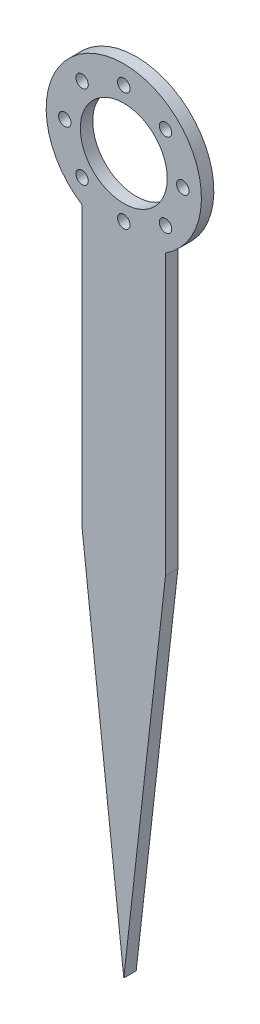
ISO-10303-21;
HEADER;
FILE_DESCRIPTION(('STEP AP214'),'2;1');
FILE_NAME('part.step','',(''),(''),'','','');
FILE_SCHEMA(('AUTOMOTIVE_DESIGN { 1 0 10303 214 1 1 1 1 }'));
ENDSEC;
DATA;
#1=APPLICATION_CONTEXT('core data for automotive mechanical design processes');
#2=APPLICATION_PROTOCOL_DEFINITION('international standard','automotive_design',2000,#1);
#3=PRODUCT_CONTEXT('',#1,'mechanical');
#4=PRODUCT('Part','Part','',(#3));
#5=PRODUCT_RELATED_PRODUCT_CATEGORY('part','',(#4));
#6=PRODUCT_DEFINITION_FORMATION('','',#4);
#7=PRODUCT_DEFINITION_CONTEXT('part definition',#1,'design');
#8=PRODUCT_DEFINITION('design','',#6,#7);
#9=PRODUCT_DEFINITION_SHAPE('','',#8);
#10=(LENGTH_UNIT() NAMED_UNIT(*) SI_UNIT(.MILLI.,.METRE.));
#11=(NAMED_UNIT(*) PLANE_ANGLE_UNIT() SI_UNIT($,.RADIAN.));
#12=(NAMED_UNIT(*) SI_UNIT($,.STERADIAN.) SOLID_ANGLE_UNIT());
#13=UNCERTAINTY_MEASURE_WITH_UNIT(LENGTH_MEASURE(1.E-05),#10,'distance_accuracy_value','');
#14=(GEOMETRIC_REPRESENTATION_CONTEXT(3) GLOBAL_UNCERTAINTY_ASSIGNED_CONTEXT((#13)) GLOBAL_UNIT_ASSIGNED_CONTEXT((#10,
#11,#12)) REPRESENTATION_CONTEXT('',''));
#15=CARTESIAN_POINT('',(0.,0.,0.));
#16=DIRECTION('',(0.,0.,1.));
#17=DIRECTION('',(1.,0.,0.));
#18=AXIS2_PLACEMENT_3D('',#15,#16,#17);
#19=CARTESIAN_POINT('',(0.,0.,4.));
#20=DIRECTION('',(0.,0.,-1.));
#21=DIRECTION('',(-1.,0.,0.));
#22=AXIS2_PLACEMENT_3D('',#19,#20,#21);
#23=PLANE('',#22);
#24=CARTESIAN_POINT('',(0.,0.,4.));
#25=DIRECTION('',(0.,0.,1.));
#26=DIRECTION('',(-1.,0.,0.));
#27=AXIS2_PLACEMENT_3D('',#24,#25,#26);
#28=CIRCLE('',#27,25.);
#29=CARTESIAN_POINT('',(13.4350288425458,-21.0831686423071,4.));
#30=VERTEX_POINT('',#29);
#31=CARTESIAN_POINT('',(-13.435028842543,-21.0831686423089,4.));
#32=VERTEX_POINT('',#31);
#33=EDGE_CURVE('E133',#30,#32,#28,.T.);
#34=ORIENTED_EDGE('',*,*,#33,.T.);
#35=DIRECTION('',(0.,-1.,0.));
#36=VECTOR('',#35,1.);
#37=CARTESIAN_POINT('',(-13.435028842543,-21.0831686423089,4.));
#38=LINE('',#37,#36);
#39=CARTESIAN_POINT('',(-13.435028842543,-111.083168642309,4.));
#40=VERTEX_POINT('',#39);
#41=EDGE_CURVE('E91',#32,#40,#38,.T.);
#42=ORIENTED_EDGE('',*,*,#41,.T.);
#43=DIRECTION('',(0.112264157951396,-0.993678398094406,0.));
#44=VECTOR('',#43,1.);
#45=CARTESIAN_POINT('',(-13.435028842543,-111.083168642309,4.));
#46=LINE('',#45,#44);
#47=CARTESIAN_POINT('',(9.12123018133562E-12,-230.,4.));
#48=VERTEX_POINT('',#47);
#49=EDGE_CURVE('E95',#40,#48,#46,.T.);
#50=ORIENTED_EDGE('',*,*,#49,.T.);
#51=DIRECTION('',(0.112264157951267,0.99367839809442,0.));
#52=VECTOR('',#51,1.);
#53=CARTESIAN_POINT('',(9.12123018133562E-12,-230.,4.));
#54=LINE('',#53,#52);
#55=CARTESIAN_POINT('',(13.4350288425458,-111.083168642307,4.));
#56=VERTEX_POINT('',#55);
#57=EDGE_CURVE('E99',#48,#56,#54,.T.);
#58=ORIENTED_EDGE('',*,*,#57,.T.);
#59=DIRECTION('',(0.,1.,0.));
#60=VECTOR('',#59,1.);
#61=CARTESIAN_POINT('',(13.4350288425458,-111.083168642307,4.));
#62=LINE('',#61,#60);
#63=EDGE_CURVE('E57',#56,#30,#62,.T.);
#64=ORIENTED_EDGE('',*,*,#63,.T.);
#65=EDGE_LOOP('',(#34,#42,#50,#58,#64));
#66=FACE_BOUND('',#65,.T.);
#67=CARTESIAN_POINT('',(0.,0.,4.));
#68=DIRECTION('',(0.,0.,1.));
#69=DIRECTION('',(1.,0.,0.));
#70=AXIS2_PLACEMENT_3D('',#67,#68,#69);
#71=CIRCLE('',#70,14.);
#72=CARTESIAN_POINT('',(14.,0.,4.));
#73=VERTEX_POINT('',#72);
#74=EDGE_CURVE('E124',#73,#73,#71,.T.);
#75=ORIENTED_EDGE('',*,*,#74,.F.);
#76=EDGE_LOOP('',(#75));
#77=FACE_BOUND('',#76,.T.);
#78=CARTESIAN_POINT('',(0.,19.,4.));
#79=DIRECTION('',(0.,0.,1.));
#80=DIRECTION('',(1.,0.,0.));
#81=AXIS2_PLACEMENT_3D('',#78,#79,#80);
#82=CIRCLE('',#81,2.);
#83=CARTESIAN_POINT('',(2.,19.,4.));
#84=VERTEX_POINT('',#83);
#85=EDGE_CURVE('E259',#84,#84,#82,.T.);
#86=ORIENTED_EDGE('',*,*,#85,.F.);
#87=EDGE_LOOP('',(#86));
#88=FACE_BOUND('',#87,.T.);
#89=CARTESIAN_POINT('',(13.4350288425446,13.435028842545,4.));
#90=DIRECTION('',(0.,0.,1.));
#91=DIRECTION('',(1.,0.,0.));
#92=AXIS2_PLACEMENT_3D('',#89,#90,#91);
#93=CIRCLE('',#92,2.00000000000009);
#94=CARTESIAN_POINT('',(15.4350288425447,13.435028842545,4.));
#95=VERTEX_POINT('',#94);
#96=EDGE_CURVE('E251',#95,#95,#93,.T.);
#97=ORIENTED_EDGE('',*,*,#96,.F.);
#98=EDGE_LOOP('',(#97));
#99=FACE_BOUND('',#98,.T.);
#100=CARTESIAN_POINT('',(19.0000000000008,8.06528475388944E-13,4.));
#101=DIRECTION('',(0.,0.,1.));
#102=DIRECTION('',(1.,0.,0.));
#103=AXIS2_PLACEMENT_3D('',#100,#101,#102);
#104=CIRCLE('',#103,2.0000000000006);
#105=CARTESIAN_POINT('',(21.0000000000014,8.06528475388944E-13,4.));
#106=VERTEX_POINT('',#105);
#107=EDGE_CURVE('E243',#106,#106,#104,.T.);
#108=ORIENTED_EDGE('',*,*,#107,.F.);
#109=EDGE_LOOP('',(#108));
#110=FACE_BOUND('',#109,.T.);
#111=CARTESIAN_POINT('',(13.4350288425458,-13.4350288425438,4.));
#112=DIRECTION('',(0.,0.,1.));
#113=DIRECTION('',(1.,0.,0.));
#114=AXIS2_PLACEMENT_3D('',#111,#112,#113);
#115=CIRCLE('',#114,2.00000000000125);
#116=CARTESIAN_POINT('',(15.435028842547,-13.4350288425438,4.));
#117=VERTEX_POINT('',#116);
#118=EDGE_CURVE('E235',#117,#117,#115,.T.);
#119=ORIENTED_EDGE('',*,*,#118,.F.);
#120=EDGE_LOOP('',(#119));
#121=FACE_BOUND('',#120,.T.);
#122=CARTESIAN_POINT('',(1.61305695077789E-12,-19.,4.));
#123=DIRECTION('',(0.,0.,1.));
#124=DIRECTION('',(1.,0.,0.));
#125=AXIS2_PLACEMENT_3D('',#122,#123,#124);
#126=CIRCLE('',#125,2.00000000000167);
#127=CARTESIAN_POINT('',(2.00000000000328,-19.,4.));
#128=VERTEX_POINT('',#127);
#129=EDGE_CURVE('E227',#128,#128,#126,.T.);
#130=ORIENTED_EDGE('',*,*,#129,.F.);
#131=EDGE_LOOP('',(#130));
#132=FACE_BOUND('',#131,.T.);
#133=CARTESIAN_POINT('',(-13.435028842543,-13.435028842545,4.));
#134=DIRECTION('',(0.,0.,1.));
#135=DIRECTION('',(1.,0.,0.));
#136=AXIS2_PLACEMENT_3D('',#133,#134,#135);
#137=CIRCLE('',#136,2.00000000000164);
#138=CARTESIAN_POINT('',(-11.4350288425414,-13.435028842545,4.));
#139=VERTEX_POINT('',#138);
#140=EDGE_CURVE('E219',#139,#139,#137,.T.);
#141=ORIENTED_EDGE('',*,*,#140,.F.);
#142=EDGE_LOOP('',(#141));
#143=FACE_BOUND('',#142,.T.);
#144=CARTESIAN_POINT('',(-18.9999999999992,-8.08855304307324E-13,4.));
#145=DIRECTION('',(0.,0.,1.));
#146=DIRECTION('',(1.,0.,0.));
#147=AXIS2_PLACEMENT_3D('',#144,#145,#146);
#148=CIRCLE('',#147,2.0000000000012);
#149=CARTESIAN_POINT('',(-16.999999999998,-8.08855304307324E-13,4.));
#150=VERTEX_POINT('',#149);
#151=EDGE_CURVE('E211',#150,#150,#148,.T.);
#152=ORIENTED_EDGE('',*,*,#151,.F.);
#153=EDGE_LOOP('',(#152));
#154=FACE_BOUND('',#153,.T.);
#155=CARTESIAN_POINT('',(-13.4350288425442,13.4350288425438,4.));
#156=DIRECTION('',(0.,0.,1.));
#157=DIRECTION('',(1.,0.,0.));
#158=AXIS2_PLACEMENT_3D('',#155,#156,#157);
#159=CIRCLE('',#158,2.00000000000062);
#160=CARTESIAN_POINT('',(-11.4350288425436,13.4350288425438,4.));
#161=VERTEX_POINT('',#160);
#162=EDGE_CURVE('E200',#161,#161,#159,.T.);
#163=ORIENTED_EDGE('',*,*,#162,.F.);
#164=EDGE_LOOP('',(#163));
#165=FACE_BOUND('',#164,.T.);
#166=ADVANCED_FACE('F39',(#66,#77,#88,#99,#110,#121,#132,#143,#154,#165),#23,.F.);
#167=CARTESIAN_POINT('',(0.,0.,0.));
#168=DIRECTION('',(0.,0.,-1.));
#169=DIRECTION('',(-1.,0.,0.));
#170=AXIS2_PLACEMENT_3D('',#167,#168,#169);
#171=PLANE('',#170);
#172=CARTESIAN_POINT('',(-18.9999999999992,-8.08855304307324E-13,0.));
#173=DIRECTION('',(0.,0.,1.));
#174=DIRECTION('',(1.,0.,0.));
#175=AXIS2_PLACEMENT_3D('',#172,#173,#174);
#176=CIRCLE('',#175,2.0000000000012);
#177=CARTESIAN_POINT('',(-16.999999999998,-8.08855304307324E-13,0.));
#178=VERTEX_POINT('',#177);
#179=EDGE_CURVE('E208',#178,#178,#176,.T.);
#180=ORIENTED_EDGE('',*,*,#179,.T.);
#181=EDGE_LOOP('',(#180));
#182=FACE_BOUND('',#181,.T.);
#183=CARTESIAN_POINT('',(1.61305695077789E-12,-19.,0.));
#184=DIRECTION('',(0.,0.,1.));
#185=DIRECTION('',(1.,0.,0.));
#186=AXIS2_PLACEMENT_3D('',#183,#184,#185);
#187=CIRCLE('',#186,2.00000000000167);
#188=CARTESIAN_POINT('',(2.00000000000328,-19.,0.));
#189=VERTEX_POINT('',#188);
#190=EDGE_CURVE('E223',#189,#189,#187,.T.);
#191=ORIENTED_EDGE('',*,*,#190,.T.);
#192=EDGE_LOOP('',(#191));
#193=FACE_BOUND('',#192,.T.);
#194=CARTESIAN_POINT('',(19.0000000000008,8.06528475388944E-13,0.));
#195=DIRECTION('',(0.,0.,1.));
#196=DIRECTION('',(1.,0.,0.));
#197=AXIS2_PLACEMENT_3D('',#194,#195,#196);
#198=CIRCLE('',#197,2.0000000000006);
#199=CARTESIAN_POINT('',(21.0000000000014,8.06528475388944E-13,0.));
#200=VERTEX_POINT('',#199);
#201=EDGE_CURVE('E239',#200,#200,#198,.T.);
#202=ORIENTED_EDGE('',*,*,#201,.T.);
#203=EDGE_LOOP('',(#202));
#204=FACE_BOUND('',#203,.T.);
#205=CARTESIAN_POINT('',(0.,19.,0.));
#206=DIRECTION('',(0.,0.,1.));
#207=DIRECTION('',(1.,0.,0.));
#208=AXIS2_PLACEMENT_3D('',#205,#206,#207);
#209=CIRCLE('',#208,2.);
#210=CARTESIAN_POINT('',(2.,19.,0.));
#211=VERTEX_POINT('',#210);
#212=EDGE_CURVE('E255',#211,#211,#209,.T.);
#213=ORIENTED_EDGE('',*,*,#212,.T.);
#214=EDGE_LOOP('',(#213));
#215=FACE_BOUND('',#214,.T.);
#216=CARTESIAN_POINT('',(0.,0.,0.));
#217=DIRECTION('',(0.,0.,1.));
#218=DIRECTION('',(-1.,0.,0.));
#219=AXIS2_PLACEMENT_3D('',#216,#217,#218);
#220=CIRCLE('',#219,25.);
#221=CARTESIAN_POINT('',(13.4350288425458,-21.0831686423071,0.));
#222=VERTEX_POINT('',#221);
#223=CARTESIAN_POINT('',(-13.435028842543,-21.0831686423089,0.));
#224=VERTEX_POINT('',#223);
#225=EDGE_CURVE('E119',#222,#224,#220,.T.);
#226=ORIENTED_EDGE('',*,*,#225,.F.);
#227=DIRECTION('',(0.,1.,0.));
#228=VECTOR('',#227,1.);
#229=CARTESIAN_POINT('',(13.4350288425458,-111.083168642307,0.));
#230=LINE('',#229,#228);
#231=CARTESIAN_POINT('',(13.4350288425458,-111.083168642307,0.));
#232=VERTEX_POINT('',#231);
#233=EDGE_CURVE('E83',#232,#222,#230,.T.);
#234=ORIENTED_EDGE('',*,*,#233,.F.);
#235=DIRECTION('',(0.112264157951267,0.99367839809442,0.));
#236=VECTOR('',#235,1.);
#237=CARTESIAN_POINT('',(9.12123018133562E-12,-230.,0.));
#238=LINE('',#237,#236);
#239=CARTESIAN_POINT('',(9.12123018133562E-12,-230.,0.));
#240=VERTEX_POINT('',#239);
#241=EDGE_CURVE('E77',#240,#232,#238,.T.);
#242=ORIENTED_EDGE('',*,*,#241,.F.);
#243=DIRECTION('',(0.112264157951396,-0.993678398094406,0.));
#244=VECTOR('',#243,1.);
#245=CARTESIAN_POINT('',(-13.435028842543,-111.083168642309,0.));
#246=LINE('',#245,#244);
#247=CARTESIAN_POINT('',(-13.435028842543,-111.083168642309,0.));
#248=VERTEX_POINT('',#247);
#249=EDGE_CURVE('E107',#248,#240,#246,.T.);
#250=ORIENTED_EDGE('',*,*,#249,.F.);
#251=DIRECTION('',(0.,-1.,0.));
#252=VECTOR('',#251,1.);
#253=CARTESIAN_POINT('',(-13.435028842543,-21.0831686423089,0.));
#254=LINE('',#253,#252);
#255=EDGE_CURVE('E123',#224,#248,#254,.T.);
#256=ORIENTED_EDGE('',*,*,#255,.F.);
#257=EDGE_LOOP('',(#226,#234,#242,#250,#256));
#258=FACE_BOUND('',#257,.T.);
#259=CARTESIAN_POINT('',(0.,0.,0.));
#260=DIRECTION('',(0.,0.,1.));
#261=DIRECTION('',(1.,0.,0.));
#262=AXIS2_PLACEMENT_3D('',#259,#260,#261);
#263=CIRCLE('',#262,14.);
#264=CARTESIAN_POINT('',(14.,0.,0.));
#265=VERTEX_POINT('',#264);
#266=EDGE_CURVE('E263',#265,#265,#263,.T.);
#267=ORIENTED_EDGE('',*,*,#266,.T.);
#268=EDGE_LOOP('',(#267));
#269=FACE_BOUND('',#268,.T.);
#270=CARTESIAN_POINT('',(13.4350288425446,13.435028842545,0.));
#271=DIRECTION('',(0.,0.,1.));
#272=DIRECTION('',(1.,0.,0.));
#273=AXIS2_PLACEMENT_3D('',#270,#271,#272);
#274=CIRCLE('',#273,2.00000000000009);
#275=CARTESIAN_POINT('',(15.4350288425447,13.435028842545,0.));
#276=VERTEX_POINT('',#275);
#277=EDGE_CURVE('E247',#276,#276,#274,.T.);
#278=ORIENTED_EDGE('',*,*,#277,.T.);
#279=EDGE_LOOP('',(#278));
#280=FACE_BOUND('',#279,.T.);
#281=CARTESIAN_POINT('',(13.4350288425458,-13.4350288425438,0.));
#282=DIRECTION('',(0.,0.,1.));
#283=DIRECTION('',(1.,0.,0.));
#284=AXIS2_PLACEMENT_3D('',#281,#282,#283);
#285=CIRCLE('',#284,2.00000000000125);
#286=CARTESIAN_POINT('',(15.435028842547,-13.4350288425438,0.));
#287=VERTEX_POINT('',#286);
#288=EDGE_CURVE('E231',#287,#287,#285,.T.);
#289=ORIENTED_EDGE('',*,*,#288,.T.);
#290=EDGE_LOOP('',(#289));
#291=FACE_BOUND('',#290,.T.);
#292=CARTESIAN_POINT('',(-13.435028842543,-13.435028842545,0.));
#293=DIRECTION('',(0.,0.,1.));
#294=DIRECTION('',(1.,0.,0.));
#295=AXIS2_PLACEMENT_3D('',#292,#293,#294);
#296=CIRCLE('',#295,2.00000000000164);
#297=CARTESIAN_POINT('',(-11.4350288425414,-13.435028842545,0.));
#298=VERTEX_POINT('',#297);
#299=EDGE_CURVE('E215',#298,#298,#296,.T.);
#300=ORIENTED_EDGE('',*,*,#299,.T.);
#301=EDGE_LOOP('',(#300));
#302=FACE_BOUND('',#301,.T.);
#303=CARTESIAN_POINT('',(-13.4350288425442,13.4350288425438,0.));
#304=DIRECTION('',(0.,0.,1.));
#305=DIRECTION('',(1.,0.,0.));
#306=AXIS2_PLACEMENT_3D('',#303,#304,#305);
#307=CIRCLE('',#306,2.00000000000062);
#308=CARTESIAN_POINT('',(-11.4350288425436,13.4350288425438,0.));
#309=VERTEX_POINT('',#308);
#310=EDGE_CURVE('E203',#309,#309,#307,.T.);
#311=ORIENTED_EDGE('',*,*,#310,.T.);
#312=EDGE_LOOP('',(#311));
#313=FACE_BOUND('',#312,.T.);
#314=ADVANCED_FACE('F140',(#182,#193,#204,#215,#258,#269,#280,#291,#302,#313),#171,.T.);
#315=CARTESIAN_POINT('',(0.,0.,4.));
#316=DIRECTION('',(0.,0.,-1.));
#317=DIRECTION('',(-1.,0.,0.));
#318=AXIS2_PLACEMENT_3D('',#315,#316,#317);
#319=CYLINDRICAL_SURFACE('',#318,25.);
#320=ORIENTED_EDGE('',*,*,#225,.T.);
#321=DIRECTION('',(0.,0.,-1.));
#322=VECTOR('',#321,1.);
#323=CARTESIAN_POINT('',(-13.435028842543,-21.0831686423089,4.));
#324=LINE('',#323,#322);
#325=EDGE_CURVE('E11',#32,#224,#324,.T.);
#326=ORIENTED_EDGE('',*,*,#325,.F.);
#327=ORIENTED_EDGE('',*,*,#33,.F.);
#328=DIRECTION('',(0.,0.,-1.));
#329=VECTOR('',#328,1.);
#330=CARTESIAN_POINT('',(13.4350288425458,-21.0831686423071,4.));
#331=LINE('',#330,#329);
#332=EDGE_CURVE('E115',#30,#222,#331,.T.);
#333=ORIENTED_EDGE('',*,*,#332,.T.);
#334=EDGE_LOOP('',(#320,#326,#327,#333));
#335=FACE_BOUND('',#334,.T.);
#336=ADVANCED_FACE('F41',(#335),#319,.T.);
#337=CARTESIAN_POINT('',(-13.435028842543,-21.0831686423089,4.));
#338=DIRECTION('',(1.,0.,0.));
#339=DIRECTION('',(0.,1.,0.));
#340=AXIS2_PLACEMENT_3D('',#337,#338,#339);
#341=PLANE('',#340);
#342=ORIENTED_EDGE('',*,*,#255,.T.);
#343=DIRECTION('',(0.,0.,-1.));
#344=VECTOR('',#343,1.);
#345=CARTESIAN_POINT('',(-13.435028842543,-111.083168642309,4.));
#346=LINE('',#345,#344);
#347=EDGE_CURVE('E49',#40,#248,#346,.T.);
#348=ORIENTED_EDGE('',*,*,#347,.F.);
#349=ORIENTED_EDGE('',*,*,#41,.F.);
#350=ORIENTED_EDGE('',*,*,#325,.T.);
#351=EDGE_LOOP('',(#342,#348,#349,#350));
#352=FACE_BOUND('',#351,.T.);
#353=ADVANCED_FACE('F364',(#352),#341,.F.);
#354=CARTESIAN_POINT('',(-13.435028842543,-111.083168642309,4.));
#355=DIRECTION('',(0.993678398094406,0.112264157951396,0.));
#356=DIRECTION('',(-0.112264157951396,0.993678398094406,0.));
#357=AXIS2_PLACEMENT_3D('',#354,#355,#356);
#358=PLANE('',#357);
#359=ORIENTED_EDGE('',*,*,#249,.T.);
#360=DIRECTION('',(0.,0.,-1.));
#361=VECTOR('',#360,1.);
#362=CARTESIAN_POINT('',(9.12123018133562E-12,-230.,4.));
#363=LINE('',#362,#361);
#364=EDGE_CURVE('E104',#48,#240,#363,.T.);
#365=ORIENTED_EDGE('',*,*,#364,.F.);
#366=ORIENTED_EDGE('',*,*,#49,.F.);
#367=ORIENTED_EDGE('',*,*,#347,.T.);
#368=EDGE_LOOP('',(#359,#365,#366,#367));
#369=FACE_BOUND('',#368,.T.);
#370=ADVANCED_FACE('F105',(#369),#358,.F.);
#371=CARTESIAN_POINT('',(9.12123018133562E-12,-230.,4.));
#372=DIRECTION('',(-0.99367839809442,0.112264157951267,0.));
#373=DIRECTION('',(-0.112264157951267,-0.99367839809442,0.));
#374=AXIS2_PLACEMENT_3D('',#371,#372,#373);
#375=PLANE('',#374);
#376=ORIENTED_EDGE('',*,*,#241,.T.);
#377=DIRECTION('',(0.,0.,-1.));
#378=VECTOR('',#377,1.);
#379=CARTESIAN_POINT('',(13.4350288425458,-111.083168642307,4.));
#380=LINE('',#379,#378);
#381=EDGE_CURVE('E109',#56,#232,#380,.T.);
#382=ORIENTED_EDGE('',*,*,#381,.F.);
#383=ORIENTED_EDGE('',*,*,#57,.F.);
#384=ORIENTED_EDGE('',*,*,#364,.T.);
#385=EDGE_LOOP('',(#376,#382,#383,#384));
#386=FACE_BOUND('',#385,.T.);
#387=ADVANCED_FACE('F111',(#386),#375,.F.);
#388=CARTESIAN_POINT('',(13.4350288425458,-111.083168642307,4.));
#389=DIRECTION('',(-1.,0.,0.));
#390=DIRECTION('',(0.,0.,1.));
#391=AXIS2_PLACEMENT_3D('',#388,#389,#390);
#392=PLANE('',#391);
#393=ORIENTED_EDGE('',*,*,#233,.T.);
#394=ORIENTED_EDGE('',*,*,#332,.F.);
#395=ORIENTED_EDGE('',*,*,#63,.F.);
#396=ORIENTED_EDGE('',*,*,#381,.T.);
#397=EDGE_LOOP('',(#393,#394,#395,#396));
#398=FACE_BOUND('',#397,.T.);
#399=ADVANCED_FACE('F145',(#398),#392,.F.);
#400=CARTESIAN_POINT('',(0.,0.,4.));
#401=DIRECTION('',(0.,0.,-1.));
#402=DIRECTION('',(-1.,0.,0.));
#403=AXIS2_PLACEMENT_3D('',#400,#401,#402);
#404=CYLINDRICAL_SURFACE('',#403,14.);
#405=ORIENTED_EDGE('',*,*,#74,.T.);
#406=EDGE_LOOP('',(#405));
#407=FACE_BOUND('',#406,.T.);
#408=ORIENTED_EDGE('',*,*,#266,.F.);
#409=EDGE_LOOP('',(#408));
#410=FACE_BOUND('',#409,.T.);
#411=ADVANCED_FACE('F147',(#407,#410),#404,.F.);
#412=CARTESIAN_POINT('',(0.,19.,4.));
#413=DIRECTION('',(0.,0.,-1.));
#414=DIRECTION('',(-1.,0.,0.));
#415=AXIS2_PLACEMENT_3D('',#412,#413,#414);
#416=CYLINDRICAL_SURFACE('',#415,2.);
#417=ORIENTED_EDGE('',*,*,#85,.T.);
#418=EDGE_LOOP('',(#417));
#419=FACE_BOUND('',#418,.T.);
#420=ORIENTED_EDGE('',*,*,#212,.F.);
#421=EDGE_LOOP('',(#420));
#422=FACE_BOUND('',#421,.T.);
#423=ADVANCED_FACE('F153',(#419,#422),#416,.F.);
#424=CARTESIAN_POINT('',(13.4350288425446,13.435028842545,4.));
#425=DIRECTION('',(0.,0.,-1.));
#426=DIRECTION('',(-1.,0.,0.));
#427=AXIS2_PLACEMENT_3D('',#424,#425,#426);
#428=CYLINDRICAL_SURFACE('',#427,2.00000000000009);
#429=ORIENTED_EDGE('',*,*,#96,.T.);
#430=EDGE_LOOP('',(#429));
#431=FACE_BOUND('',#430,.T.);
#432=ORIENTED_EDGE('',*,*,#277,.F.);
#433=EDGE_LOOP('',(#432));
#434=FACE_BOUND('',#433,.T.);
#435=ADVANCED_FACE('F167',(#431,#434),#428,.F.);
#436=CARTESIAN_POINT('',(19.0000000000008,8.06528475388944E-13,4.));
#437=DIRECTION('',(0.,0.,-1.));
#438=DIRECTION('',(-1.,0.,0.));
#439=AXIS2_PLACEMENT_3D('',#436,#437,#438);
#440=CYLINDRICAL_SURFACE('',#439,2.0000000000006);
#441=ORIENTED_EDGE('',*,*,#107,.T.);
#442=EDGE_LOOP('',(#441));
#443=FACE_BOUND('',#442,.T.);
#444=ORIENTED_EDGE('',*,*,#201,.F.);
#445=EDGE_LOOP('',(#444));
#446=FACE_BOUND('',#445,.T.);
#447=ADVANCED_FACE('F171',(#443,#446),#440,.F.);
#448=CARTESIAN_POINT('',(13.4350288425458,-13.4350288425438,4.));
#449=DIRECTION('',(0.,0.,-1.));
#450=DIRECTION('',(-1.,0.,0.));
#451=AXIS2_PLACEMENT_3D('',#448,#449,#450);
#452=CYLINDRICAL_SURFACE('',#451,2.00000000000125);
#453=ORIENTED_EDGE('',*,*,#118,.T.);
#454=EDGE_LOOP('',(#453));
#455=FACE_BOUND('',#454,.T.);
#456=ORIENTED_EDGE('',*,*,#288,.F.);
#457=EDGE_LOOP('',(#456));
#458=FACE_BOUND('',#457,.T.);
#459=ADVANCED_FACE('F175',(#455,#458),#452,.F.);
#460=CARTESIAN_POINT('',(1.61305695077789E-12,-19.,4.));
#461=DIRECTION('',(0.,0.,-1.));
#462=DIRECTION('',(-1.,0.,0.));
#463=AXIS2_PLACEMENT_3D('',#460,#461,#462);
#464=CYLINDRICAL_SURFACE('',#463,2.00000000000167);
#465=ORIENTED_EDGE('',*,*,#129,.T.);
#466=EDGE_LOOP('',(#465));
#467=FACE_BOUND('',#466,.T.);
#468=ORIENTED_EDGE('',*,*,#190,.F.);
#469=EDGE_LOOP('',(#468));
#470=FACE_BOUND('',#469,.T.);
#471=ADVANCED_FACE('F179',(#467,#470),#464,.F.);
#472=CARTESIAN_POINT('',(-13.435028842543,-13.435028842545,4.));
#473=DIRECTION('',(0.,0.,-1.));
#474=DIRECTION('',(-1.,0.,0.));
#475=AXIS2_PLACEMENT_3D('',#472,#473,#474);
#476=CYLINDRICAL_SURFACE('',#475,2.00000000000164);
#477=ORIENTED_EDGE('',*,*,#140,.T.);
#478=EDGE_LOOP('',(#477));
#479=FACE_BOUND('',#478,.T.);
#480=ORIENTED_EDGE('',*,*,#299,.F.);
#481=EDGE_LOOP('',(#480));
#482=FACE_BOUND('',#481,.T.);
#483=ADVANCED_FACE('F183',(#479,#482),#476,.F.);
#484=CARTESIAN_POINT('',(-18.9999999999992,-8.08855304307324E-13,4.));
#485=DIRECTION('',(0.,0.,-1.));
#486=DIRECTION('',(-1.,0.,0.));
#487=AXIS2_PLACEMENT_3D('',#484,#485,#486);
#488=CYLINDRICAL_SURFACE('',#487,2.0000000000012);
#489=ORIENTED_EDGE('',*,*,#151,.T.);
#490=EDGE_LOOP('',(#489));
#491=FACE_BOUND('',#490,.T.);
#492=ORIENTED_EDGE('',*,*,#179,.F.);
#493=EDGE_LOOP('',(#492));
#494=FACE_BOUND('',#493,.T.);
#495=ADVANCED_FACE('F187',(#491,#494),#488,.F.);
#496=CARTESIAN_POINT('',(-13.4350288425442,13.4350288425438,4.));
#497=DIRECTION('',(0.,0.,-1.));
#498=DIRECTION('',(-1.,0.,0.));
#499=AXIS2_PLACEMENT_3D('',#496,#497,#498);
#500=CYLINDRICAL_SURFACE('',#499,2.00000000000062);
#501=ORIENTED_EDGE('',*,*,#162,.T.);
#502=EDGE_LOOP('',(#501));
#503=FACE_BOUND('',#502,.T.);
#504=ORIENTED_EDGE('',*,*,#310,.F.);
#505=EDGE_LOOP('',(#504));
#506=FACE_BOUND('',#505,.T.);
#507=ADVANCED_FACE('F191',(#503,#506),#500,.F.);
#508=CLOSED_SHELL('',(#166,#314,#336,#353,#370,#387,#399,#411,#423,#435,#447,#459,#471,#483,
#495,#507));
#509=MANIFOLD_SOLID_BREP('B2',#508);
#510=ADVANCED_BREP_SHAPE_REPRESENTATION('',(#18,#509),#14);
#511=SHAPE_DEFINITION_REPRESENTATION(#9,#510);
ENDSEC;
END-ISO-10303-21;
